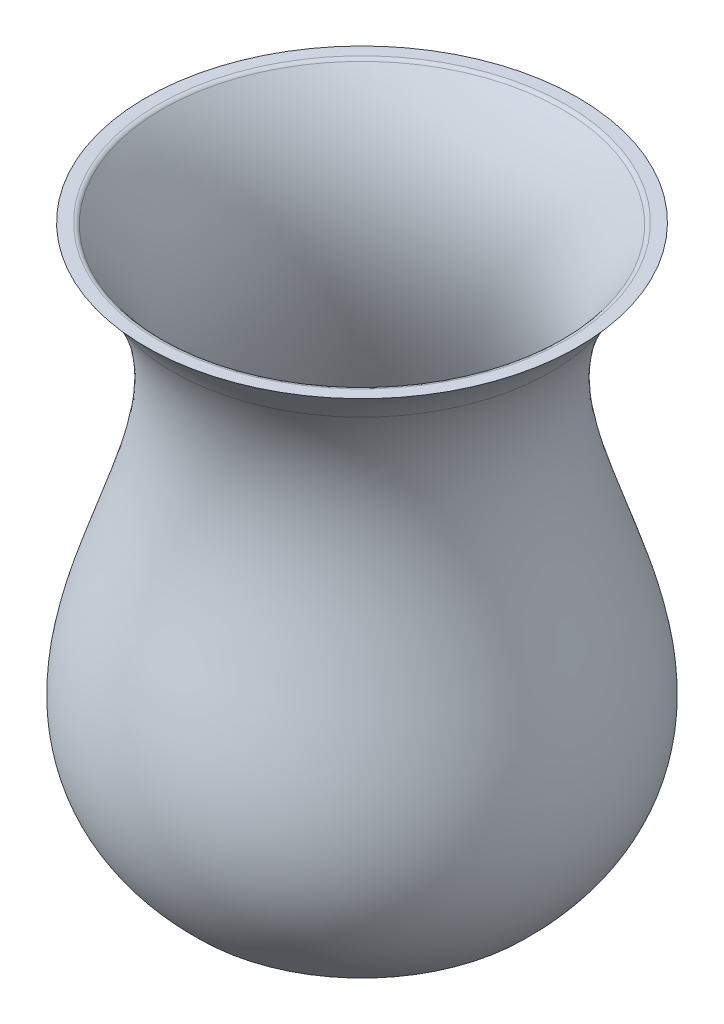
ISO-10303-21;
HEADER;
FILE_DESCRIPTION(('STEP AP214'),'2;1');
FILE_NAME('part.step','',(''),(''),'','','');
FILE_SCHEMA(('AUTOMOTIVE_DESIGN { 1 0 10303 214 1 1 1 1 }'));
ENDSEC;
DATA;
#1=APPLICATION_CONTEXT('core data for automotive mechanical design processes');
#2=APPLICATION_PROTOCOL_DEFINITION('international standard','automotive_design',2000,#1);
#3=PRODUCT_CONTEXT('',#1,'mechanical');
#4=PRODUCT('Part','Part','',(#3));
#5=PRODUCT_RELATED_PRODUCT_CATEGORY('part','',(#4));
#6=PRODUCT_DEFINITION_FORMATION('','',#4);
#7=PRODUCT_DEFINITION_CONTEXT('part definition',#1,'design');
#8=PRODUCT_DEFINITION('design','',#6,#7);
#9=PRODUCT_DEFINITION_SHAPE('','',#8);
#10=(LENGTH_UNIT() NAMED_UNIT(*) SI_UNIT(.MILLI.,.METRE.));
#11=(NAMED_UNIT(*) PLANE_ANGLE_UNIT() SI_UNIT($,.RADIAN.));
#12=(NAMED_UNIT(*) SI_UNIT($,.STERADIAN.) SOLID_ANGLE_UNIT());
#13=UNCERTAINTY_MEASURE_WITH_UNIT(LENGTH_MEASURE(1.E-05),#10,'distance_accuracy_value','');
#14=(GEOMETRIC_REPRESENTATION_CONTEXT(3) GLOBAL_UNCERTAINTY_ASSIGNED_CONTEXT((#13)) GLOBAL_UNIT_ASSIGNED_CONTEXT((#10,
#11,#12)) REPRESENTATION_CONTEXT('',''));
#15=CARTESIAN_POINT('',(0.,0.,0.));
#16=DIRECTION('',(0.,0.,1.));
#17=DIRECTION('',(1.,0.,0.));
#18=AXIS2_PLACEMENT_3D('',#15,#16,#17);
#19=CARTESIAN_POINT('',(30.,0.,0.));
#20=CARTESIAN_POINT('',(63.6299733814836,31.7031630259168,0.));
#21=CARTESIAN_POINT('',(8.21429828910841,65.6763658658362,0.));
#22=CARTESIAN_POINT('',(40.,100.,0.));
#23=B_SPLINE_CURVE_WITH_KNOTS('',3,(#19,#20,#21,#22),.UNSPECIFIED.,.F.,.F.,(4,4),(0.,1.),.UNSPECIFIED.);
#24=CARTESIAN_POINT('',(0.,0.,0.));
#25=DIRECTION('',(0.,-1.,0.));
#26=AXIS1_PLACEMENT('',#24,#25);
#27=SURFACE_OF_REVOLUTION('',#23,#26);
#28=CARTESIAN_POINT('',(0.,0.,0.));
#29=DIRECTION('',(0.,-1.,0.));
#30=DIRECTION('',(0.,0.,-1.));
#31=AXIS2_PLACEMENT_3D('',#28,#29,#30);
#32=CIRCLE('',#31,30.);
#33=CARTESIAN_POINT('',(0.,0.,-30.));
#34=VERTEX_POINT('',#33);
#35=EDGE_CURVE('E60',#34,#34,#32,.T.);
#36=ORIENTED_EDGE('',*,*,#35,.F.);
#37=EDGE_LOOP('',(#36));
#38=FACE_BOUND('',#37,.T.);
#39=CARTESIAN_POINT('',(0.,93.4586613205445,0.));
#40=DIRECTION('',(0.,-1.,0.));
#41=DIRECTION('',(0.,0.,-1.));
#42=AXIS2_PLACEMENT_3D('',#39,#40,#41);
#43=CIRCLE('',#42,34.9499145074642);
#44=CARTESIAN_POINT('',(0.,93.4586613205445,-34.9499145074642));
#45=VERTEX_POINT('',#44);
#46=EDGE_CURVE('E11',#45,#45,#43,.T.);
#47=ORIENTED_EDGE('',*,*,#46,.T.);
#48=EDGE_LOOP('',(#47));
#49=FACE_BOUND('',#48,.T.);
#50=ADVANCED_FACE('F34',(#38,#49),#27,.F.);
#51=CARTESIAN_POINT('',(40.,100.,0.));
#52=DIRECTION('',(0.,1.,0.));
#53=DIRECTION('',(0.,0.,1.));
#54=AXIS2_PLACEMENT_3D('',#51,#52,#53);
#55=PLANE('',#54);
#56=CARTESIAN_POINT('',(0.,100.,0.));
#57=DIRECTION('',(0.,1.,0.));
#58=DIRECTION('',(0.,0.,1.));
#59=AXIS2_PLACEMENT_3D('',#56,#57,#58);
#60=CIRCLE('',#59,37.7782619473767);
#61=CARTESIAN_POINT('',(0.,100.,37.7782619473767));
#62=VERTEX_POINT('',#61);
#63=EDGE_CURVE('E41',#62,#62,#60,.F.);
#64=ORIENTED_EDGE('',*,*,#63,.T.);
#65=EDGE_LOOP('',(#64));
#66=FACE_BOUND('',#65,.T.);
#67=CARTESIAN_POINT('',(0.,100.,0.));
#68=DIRECTION('',(0.,-1.,0.));
#69=DIRECTION('',(0.,0.,-1.));
#70=AXIS2_PLACEMENT_3D('',#67,#68,#69);
#71=CIRCLE('',#70,40.);
#72=CARTESIAN_POINT('',(0.,100.,-40.));
#73=VERTEX_POINT('',#72);
#74=EDGE_CURVE('E57',#73,#73,#71,.T.);
#75=ORIENTED_EDGE('',*,*,#74,.F.);
#76=EDGE_LOOP('',(#75));
#77=FACE_BOUND('',#76,.T.);
#78=ADVANCED_FACE('F76',(#66,#77),#55,.T.);
#79=ORIENTED_EDGE('',*,*,#46,.F.);
#80=EDGE_LOOP('',(#79));
#81=FACE_BOUND('',#80,.T.);
#82=ORIENTED_EDGE('',*,*,#74,.T.);
#83=EDGE_LOOP('',(#82));
#84=FACE_BOUND('',#83,.T.);
#85=ADVANCED_FACE('F70',(#81,#84),#27,.F.);
#86=CARTESIAN_POINT('',(30.,0.,0.));
#87=DIRECTION('',(0.,-1.,0.));
#88=DIRECTION('',(0.,0.,-1.));
#89=AXIS2_PLACEMENT_3D('',#86,#87,#88);
#90=PLANE('',#89);
#91=ORIENTED_EDGE('',*,*,#35,.T.);
#92=EDGE_LOOP('',(#91));
#93=FACE_BOUND('',#92,.T.);
#94=ADVANCED_FACE('F75',(#93),#90,.T.);
#95=CARTESIAN_POINT('',(30.,0.,0.));
#96=CARTESIAN_POINT('',(63.6299733814836,31.7031630259168,0.));
#97=CARTESIAN_POINT('',(8.21429828910841,65.6763658658362,0.));
#98=CARTESIAN_POINT('',(40.,100.,0.));
#99=B_SPLINE_CURVE_WITH_KNOTS('',3,(#95,#96,#97,#98),.UNSPECIFIED.,.F.,.F.,(4,4),(0.,1.),.UNSPECIFIED.);
#100=CARTESIAN_POINT('',(0.,0.,0.));
#101=DIRECTION('',(0.,-1.,0.));
#102=AXIS1_PLACEMENT('',#100,#101);
#103=SURFACE_OF_REVOLUTION('',#99,#102);
#104=OFFSET_SURFACE('',#103,2.,.F.);
#105=CARTESIAN_POINT('',(0.,2.28987318492507,0.));
#106=DIRECTION('',(0.,-1.,0.));
#107=DIRECTION('',(0.,0.,-1.));
#108=AXIS2_PLACEMENT_3D('',#105,#106,#107);
#109=CIRCLE('',#108,29.4915535836188);
#110=CARTESIAN_POINT('',(0.,2.28987318492507,-29.4915535836188));
#111=VERTEX_POINT('',#110);
#112=EDGE_CURVE('E49',#111,#111,#109,.T.);
#113=ORIENTED_EDGE('',*,*,#112,.T.);
#114=EDGE_LOOP('',(#113));
#115=FACE_BOUND('',#114,.T.);
#116=CARTESIAN_POINT('',(0.,99.6460609866268,0.));
#117=DIRECTION('',(0.,-1.,0.));
#118=DIRECTION('',(0.,0.,-1.));
#119=AXIS2_PLACEMENT_3D('',#116,#117,#118);
#120=CIRCLE('',#119,37.0149761545318);
#121=CARTESIAN_POINT('',(0.,99.6460609866268,-37.0149761545318));
#122=VERTEX_POINT('',#121);
#123=EDGE_CURVE('E54',#122,#122,#120,.F.);
#124=ORIENTED_EDGE('',*,*,#123,.T.);
#125=EDGE_LOOP('',(#124));
#126=FACE_BOUND('',#125,.T.);
#127=ADVANCED_FACE('F78',(#115,#126),#104,.T.);
#128=CARTESIAN_POINT('',(30.,2.,0.));
#129=DIRECTION('',(0.,-1.,0.));
#130=DIRECTION('',(0.,0.,-1.));
#131=AXIS2_PLACEMENT_3D('',#128,#129,#130);
#132=PLANE('',#131);
#133=CARTESIAN_POINT('',(0.,2.,0.));
#134=DIRECTION('',(0.,-1.,0.));
#135=DIRECTION('',(0.,0.,-1.));
#136=AXIS2_PLACEMENT_3D('',#133,#134,#135);
#137=CIRCLE('',#136,28.787479790248);
#138=CARTESIAN_POINT('',(0.,2.,-28.787479790248));
#139=VERTEX_POINT('',#138);
#140=EDGE_CURVE('E45',#139,#139,#137,.F.);
#141=ORIENTED_EDGE('',*,*,#140,.T.);
#142=EDGE_LOOP('',(#141));
#143=FACE_BOUND('',#142,.T.);
#144=ADVANCED_FACE('F79',(#143),#132,.F.);
#145=CARTESIAN_POINT('',(0.,3.,0.));
#146=DIRECTION('',(0.,-1.,0.));
#147=DIRECTION('',(0.,0.,-1.));
#148=AXIS2_PLACEMENT_3D('',#145,#146,#147);
#149=TOROIDAL_SURFACE('',#148,28.787479790248,1.);
#150=ORIENTED_EDGE('',*,*,#140,.F.);
#151=EDGE_LOOP('',(#150));
#152=FACE_BOUND('',#151,.T.);
#153=ORIENTED_EDGE('',*,*,#112,.F.);
#154=EDGE_LOOP('',(#153));
#155=FACE_BOUND('',#154,.T.);
#156=ADVANCED_FACE('F82',(#152,#155),#149,.F.);
#157=CARTESIAN_POINT('',(0.,99.,0.));
#158=DIRECTION('',(0.,-1.,0.));
#159=DIRECTION('',(0.,0.,-1.));
#160=AXIS2_PLACEMENT_3D('',#157,#158,#159);
#161=TOROIDAL_SURFACE('',#160,37.7782619473767,1.);
#162=ORIENTED_EDGE('',*,*,#123,.F.);
#163=EDGE_LOOP('',(#162));
#164=FACE_BOUND('',#163,.T.);
#165=ORIENTED_EDGE('',*,*,#63,.F.);
#166=EDGE_LOOP('',(#165));
#167=FACE_BOUND('',#166,.T.);
#168=ADVANCED_FACE('F36',(#164,#167),#161,.T.);
#169=CLOSED_SHELL('',(#50,#78,#85,#94,#127,#144,#156,#168));
#170=MANIFOLD_SOLID_BREP('B2',#169);
#171=ADVANCED_BREP_SHAPE_REPRESENTATION('',(#18,#170),#14);
#172=SHAPE_DEFINITION_REPRESENTATION(#9,#171);
ENDSEC;
END-ISO-10303-21;
